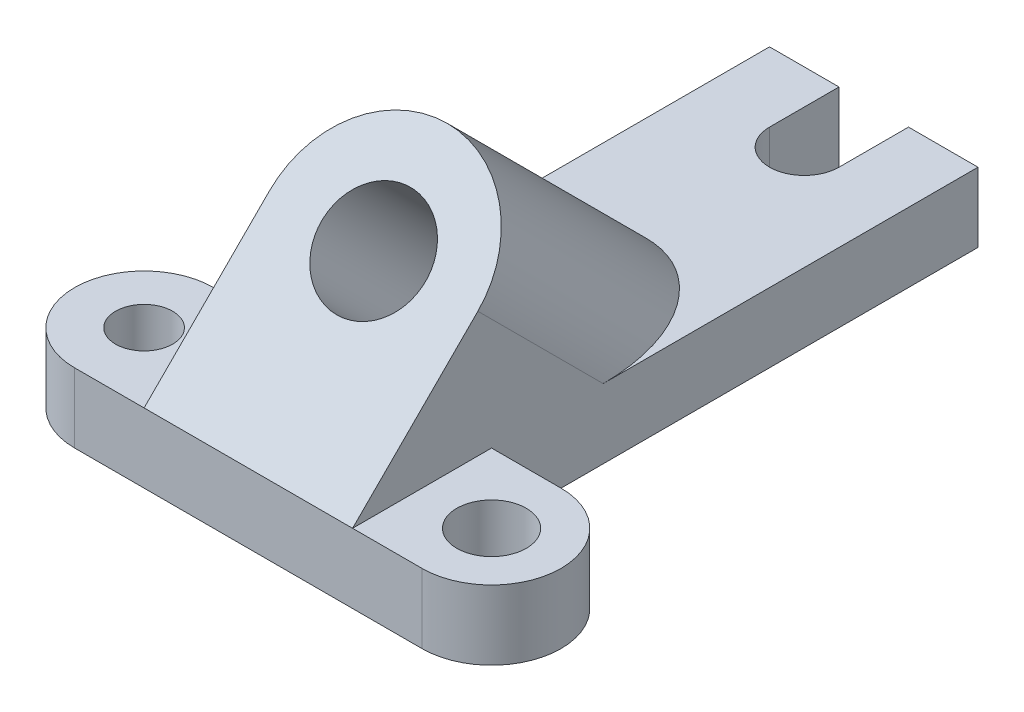
ISO-10303-21;
HEADER;
FILE_DESCRIPTION(('STEP AP214'),'2;1');
FILE_NAME('part.step','',(''),(''),'','','');
FILE_SCHEMA(('AUTOMOTIVE_DESIGN { 1 0 10303 214 1 1 1 1 }'));
ENDSEC;
DATA;
#1=APPLICATION_CONTEXT('core data for automotive mechanical design processes');
#2=APPLICATION_PROTOCOL_DEFINITION('international standard','automotive_design',2000,#1);
#3=PRODUCT_CONTEXT('',#1,'mechanical');
#4=PRODUCT('Part','Part','',(#3));
#5=PRODUCT_RELATED_PRODUCT_CATEGORY('part','',(#4));
#6=PRODUCT_DEFINITION_FORMATION('','',#4);
#7=PRODUCT_DEFINITION_CONTEXT('part definition',#1,'design');
#8=PRODUCT_DEFINITION('design','',#6,#7);
#9=PRODUCT_DEFINITION_SHAPE('','',#8);
#10=(LENGTH_UNIT() NAMED_UNIT(*) SI_UNIT(.MILLI.,.METRE.));
#11=(NAMED_UNIT(*) PLANE_ANGLE_UNIT() SI_UNIT($,.RADIAN.));
#12=(NAMED_UNIT(*) SI_UNIT($,.STERADIAN.) SOLID_ANGLE_UNIT());
#13=UNCERTAINTY_MEASURE_WITH_UNIT(LENGTH_MEASURE(1.E-05),#10,'distance_accuracy_value','');
#14=(GEOMETRIC_REPRESENTATION_CONTEXT(3) GLOBAL_UNCERTAINTY_ASSIGNED_CONTEXT((#13)) GLOBAL_UNIT_ASSIGNED_CONTEXT((#10,
#11,#12)) REPRESENTATION_CONTEXT('',''));
#15=CARTESIAN_POINT('',(0.,0.,0.));
#16=DIRECTION('',(0.,0.,1.));
#17=DIRECTION('',(1.,0.,0.));
#18=AXIS2_PLACEMENT_3D('',#15,#16,#17);
#19=CARTESIAN_POINT('',(0.,0.,0.));
#20=DIRECTION('',(0.,1.,0.));
#21=DIRECTION('',(0.,0.,1.));
#22=AXIS2_PLACEMENT_3D('',#19,#20,#21);
#23=PLANE('',#22);
#24=CARTESIAN_POINT('',(-50.,0.,63.4930824871353));
#25=DIRECTION('',(0.,1.,0.));
#26=DIRECTION('',(0.,0.,1.));
#27=AXIS2_PLACEMENT_3D('',#24,#25,#26);
#28=CIRCLE('',#27,8.21730311063648);
#29=CARTESIAN_POINT('',(-50.,0.,71.7103855977718));
#30=VERTEX_POINT('',#29);
#31=EDGE_CURVE('E237',#30,#30,#28,.T.);
#32=ORIENTED_EDGE('',*,*,#31,.F.);
#33=EDGE_LOOP('',(#32));
#34=FACE_BOUND('',#33,.T.);
#35=DIRECTION('',(0.,0.,1.));
#36=VECTOR('',#35,1.);
#37=CARTESIAN_POINT('',(-30.,0.,-58.2548729699942));
#38=LINE('',#37,#36);
#39=CARTESIAN_POINT('',(-30.,0.,43.4930824871353));
#40=VERTEX_POINT('',#39);
#41=CARTESIAN_POINT('',(-30.,0.,83.4930824871353));
#42=VERTEX_POINT('',#41);
#43=EDGE_CURVE('E77',#40,#42,#38,.T.);
#44=ORIENTED_EDGE('',*,*,#43,.F.);
#45=DIRECTION('',(1.,0.,0.));
#46=VECTOR('',#45,1.);
#47=CARTESIAN_POINT('',(0.,0.,43.4930824871353));
#48=LINE('',#47,#46);
#49=CARTESIAN_POINT('',(-50.,0.,43.4930824871353));
#50=VERTEX_POINT('',#49);
#51=EDGE_CURVE('E244',#50,#40,#48,.T.);
#52=ORIENTED_EDGE('',*,*,#51,.F.);
#53=CARTESIAN_POINT('',(-50.,0.,63.4930824871353));
#54=DIRECTION('',(0.,1.,0.));
#55=DIRECTION('',(0.,0.,1.));
#56=AXIS2_PLACEMENT_3D('',#53,#54,#55);
#57=CIRCLE('',#56,20.);
#58=CARTESIAN_POINT('',(-50.,0.,83.4930824871353));
#59=VERTEX_POINT('',#58);
#60=EDGE_CURVE('E270',#50,#59,#57,.T.);
#61=ORIENTED_EDGE('',*,*,#60,.T.);
#62=DIRECTION('',(1.,0.,0.));
#63=VECTOR('',#62,1.);
#64=CARTESIAN_POINT('',(0.,0.,83.4930824871353));
#65=LINE('',#64,#63);
#66=EDGE_CURVE('E274',#59,#42,#65,.T.);
#67=ORIENTED_EDGE('',*,*,#66,.T.);
#68=EDGE_LOOP('',(#44,#52,#61,#67));
#69=FACE_BOUND('',#68,.T.);
#70=ADVANCED_FACE('F68',(#34,#69),#23,.T.);
#71=CARTESIAN_POINT('',(50.,0.,63.4930824871353));
#72=DIRECTION('',(0.,1.,0.));
#73=DIRECTION('',(0.,0.,1.));
#74=AXIS2_PLACEMENT_3D('',#71,#72,#73);
#75=CIRCLE('',#74,10.);
#76=CARTESIAN_POINT('',(50.,0.,73.4930824871353));
#77=VERTEX_POINT('',#76);
#78=EDGE_CURVE('E227',#77,#77,#75,.T.);
#79=ORIENTED_EDGE('',*,*,#78,.F.);
#80=EDGE_LOOP('',(#79));
#81=FACE_BOUND('',#80,.T.);
#82=DIRECTION('',(1.,0.,0.));
#83=VECTOR('',#82,1.);
#84=CARTESIAN_POINT('',(0.,0.,43.4930824871353));
#85=LINE('',#84,#83);
#86=CARTESIAN_POINT('',(30.,0.,43.4930824871353));
#87=VERTEX_POINT('',#86);
#88=CARTESIAN_POINT('',(50.,0.,43.4930824871353));
#89=VERTEX_POINT('',#88);
#90=EDGE_CURVE('E280',#87,#89,#85,.T.);
#91=ORIENTED_EDGE('',*,*,#90,.F.);
#92=DIRECTION('',(0.,0.,1.));
#93=VECTOR('',#92,1.);
#94=CARTESIAN_POINT('',(30.,0.,-58.2548729699942));
#95=LINE('',#94,#93);
#96=CARTESIAN_POINT('',(30.,0.,83.4930824871353));
#97=VERTEX_POINT('',#96);
#98=EDGE_CURVE('E12',#87,#97,#95,.T.);
#99=ORIENTED_EDGE('',*,*,#98,.T.);
#100=CARTESIAN_POINT('',(50.,0.,83.4930824871353));
#101=VERTEX_POINT('',#100);
#102=EDGE_CURVE('E273',#97,#101,#65,.T.);
#103=ORIENTED_EDGE('',*,*,#102,.T.);
#104=CARTESIAN_POINT('',(50.,0.,63.4930824871353));
#105=DIRECTION('',(0.,1.,0.));
#106=DIRECTION('',(0.,0.,1.));
#107=AXIS2_PLACEMENT_3D('',#104,#105,#106);
#108=CIRCLE('',#107,20.);
#109=EDGE_CURVE('E277',#101,#89,#108,.T.);
#110=ORIENTED_EDGE('',*,*,#109,.T.);
#111=EDGE_LOOP('',(#91,#99,#103,#110));
#112=FACE_BOUND('',#111,.T.);
#113=ADVANCED_FACE('F336',(#81,#112),#23,.T.);
#114=CARTESIAN_POINT('',(0.,-20.,-96.5069175128647));
#115=DIRECTION('',(0.,0.,-1.));
#116=DIRECTION('',(-1.,0.,0.));
#117=AXIS2_PLACEMENT_3D('',#114,#115,#116);
#118=PLANE('',#117);
#119=DIRECTION('',(0.,1.,0.));
#120=VECTOR('',#119,1.);
#121=CARTESIAN_POINT('',(-10.,-20.,-96.5069175128647));
#122=LINE('',#121,#120);
#123=CARTESIAN_POINT('',(-10.,-20.,-96.5069175128647));
#124=VERTEX_POINT('',#123);
#125=CARTESIAN_POINT('',(-10.,0.,-96.5069175128647));
#126=VERTEX_POINT('',#125);
#127=EDGE_CURVE('E225',#124,#126,#122,.T.);
#128=ORIENTED_EDGE('',*,*,#127,.F.);
#129=DIRECTION('',(-1.,0.,0.));
#130=VECTOR('',#129,1.);
#131=CARTESIAN_POINT('',(0.,-20.,-96.5069175128647));
#132=LINE('',#131,#130);
#133=CARTESIAN_POINT('',(-30.,-20.,-96.5069175128647));
#134=VERTEX_POINT('',#133);
#135=EDGE_CURVE('E258',#124,#134,#132,.T.);
#136=ORIENTED_EDGE('',*,*,#135,.T.);
#137=DIRECTION('',(0.,1.,0.));
#138=VECTOR('',#137,1.);
#139=CARTESIAN_POINT('',(-30.,-20.,-96.5069175128647));
#140=LINE('',#139,#138);
#141=CARTESIAN_POINT('',(-30.,0.,-96.5069175128647));
#142=VERTEX_POINT('',#141);
#143=EDGE_CURVE('E296',#134,#142,#140,.T.);
#144=ORIENTED_EDGE('',*,*,#143,.T.);
#145=DIRECTION('',(-1.,0.,0.));
#146=VECTOR('',#145,1.);
#147=CARTESIAN_POINT('',(0.,0.,-96.5069175128647));
#148=LINE('',#147,#146);
#149=EDGE_CURVE('E285',#126,#142,#148,.T.);
#150=ORIENTED_EDGE('',*,*,#149,.F.);
#151=EDGE_LOOP('',(#128,#136,#144,#150));
#152=FACE_BOUND('',#151,.T.);
#153=ADVANCED_FACE('F355',(#152),#118,.T.);
#154=CARTESIAN_POINT('',(-50.,-20.,63.4930824871353));
#155=DIRECTION('',(0.,1.,0.));
#156=DIRECTION('',(0.,0.,1.));
#157=AXIS2_PLACEMENT_3D('',#154,#155,#156);
#158=CYLINDRICAL_SURFACE('',#157,20.);
#159=ORIENTED_EDGE('',*,*,#60,.F.);
#160=DIRECTION('',(0.,1.,0.));
#161=VECTOR('',#160,1.);
#162=CARTESIAN_POINT('',(-50.,-20.,43.4930824871353));
#163=LINE('',#162,#161);
#164=CARTESIAN_POINT('',(-50.,-20.,43.4930824871353));
#165=VERTEX_POINT('',#164);
#166=EDGE_CURVE('E206',#165,#50,#163,.T.);
#167=ORIENTED_EDGE('',*,*,#166,.F.);
#168=CARTESIAN_POINT('',(-50.,-20.,63.4930824871353));
#169=DIRECTION('',(0.,1.,0.));
#170=DIRECTION('',(0.,0.,1.));
#171=AXIS2_PLACEMENT_3D('',#168,#169,#170);
#172=CIRCLE('',#171,20.);
#173=CARTESIAN_POINT('',(-50.,-20.,83.4930824871353));
#174=VERTEX_POINT('',#173);
#175=EDGE_CURVE('E243',#165,#174,#172,.T.);
#176=ORIENTED_EDGE('',*,*,#175,.T.);
#177=DIRECTION('',(0.,1.,0.));
#178=VECTOR('',#177,1.);
#179=CARTESIAN_POINT('',(-50.,-20.,83.4930824871353));
#180=LINE('',#179,#178);
#181=EDGE_CURVE('E72',#174,#59,#180,.T.);
#182=ORIENTED_EDGE('',*,*,#181,.T.);
#183=EDGE_LOOP('',(#159,#167,#176,#182));
#184=FACE_BOUND('',#183,.T.);
#185=ADVANCED_FACE('F314',(#184),#158,.T.);
#186=CARTESIAN_POINT('',(0.,-20.,43.4930824871353));
#187=DIRECTION('',(0.,0.,1.));
#188=DIRECTION('',(1.,0.,0.));
#189=AXIS2_PLACEMENT_3D('',#186,#187,#188);
#190=PLANE('',#189);
#191=ORIENTED_EDGE('',*,*,#51,.T.);
#192=DIRECTION('',(0.,1.,0.));
#193=VECTOR('',#192,1.);
#194=CARTESIAN_POINT('',(-30.,-20.,43.4930824871353));
#195=LINE('',#194,#193);
#196=CARTESIAN_POINT('',(-30.,-20.,43.4930824871353));
#197=VERTEX_POINT('',#196);
#198=EDGE_CURVE('E294',#197,#40,#195,.T.);
#199=ORIENTED_EDGE('',*,*,#198,.F.);
#200=DIRECTION('',(1.,0.,0.));
#201=VECTOR('',#200,1.);
#202=CARTESIAN_POINT('',(0.,-20.,43.4930824871353));
#203=LINE('',#202,#201);
#204=EDGE_CURVE('E265',#165,#197,#203,.T.);
#205=ORIENTED_EDGE('',*,*,#204,.F.);
#206=ORIENTED_EDGE('',*,*,#166,.T.);
#207=EDGE_LOOP('',(#191,#199,#205,#206));
#208=FACE_BOUND('',#207,.T.);
#209=ADVANCED_FACE('F322',(#208),#190,.F.);
#210=CARTESIAN_POINT('',(-30.,-20.,0.));
#211=DIRECTION('',(1.,0.,0.));
#212=DIRECTION('',(0.,0.,-1.));
#213=AXIS2_PLACEMENT_3D('',#210,#211,#212);
#214=PLANE('',#213);
#215=ORIENTED_EDGE('',*,*,#198,.T.);
#216=ORIENTED_EDGE('',*,*,#43,.T.);
#217=DIRECTION('',(0.,0.707106781186544,-0.707106781186551));
#218=VECTOR('',#217,1.);
#219=CARTESIAN_POINT('',(-30.,41.7465412435677,41.7465412435673));
#220=LINE('',#219,#218);
#221=CARTESIAN_POINT('',(-30.,36.0624458405137,47.4306366466212));
#222=VERTEX_POINT('',#221);
#223=EDGE_CURVE('E187',#42,#222,#220,.T.);
#224=ORIENTED_EDGE('',*,*,#223,.T.);
#225=DIRECTION('',(0.,0.707106781186551,0.707106781186544));
#226=VECTOR('',#225,1.);
#227=CARTESIAN_POINT('',(-30.,-63.9389683730487,-52.5707775669402));
#228=LINE('',#227,#226);
#229=CARTESIAN_POINT('',(-30.,0.,11.3681908061078));
#230=VERTEX_POINT('',#229);
#231=EDGE_CURVE('E175',#230,#222,#228,.T.);
#232=ORIENTED_EDGE('',*,*,#231,.F.);
#233=DIRECTION('',(0.,0.,-1.));
#234=VECTOR('',#233,1.);
#235=CARTESIAN_POINT('',(-30.,0.,0.));
#236=LINE('',#235,#234);
#237=EDGE_CURVE('E289',#230,#142,#236,.T.);
#238=ORIENTED_EDGE('',*,*,#237,.T.);
#239=ORIENTED_EDGE('',*,*,#143,.F.);
#240=DIRECTION('',(0.,0.,-1.));
#241=VECTOR('',#240,1.);
#242=CARTESIAN_POINT('',(-30.,-20.,0.));
#243=LINE('',#242,#241);
#244=EDGE_CURVE('E262',#197,#134,#243,.T.);
#245=ORIENTED_EDGE('',*,*,#244,.F.);
#246=EDGE_LOOP('',(#215,#216,#224,#232,#238,#239,#245));
#247=FACE_BOUND('',#246,.T.);
#248=ADVANCED_FACE('F189',(#247),#214,.F.);
#249=DIRECTION('',(0.,1.,0.));
#250=VECTOR('',#249,1.);
#251=CARTESIAN_POINT('',(9.99999999999997,-20.,-96.5069175128647));
#252=LINE('',#251,#250);
#253=CARTESIAN_POINT('',(9.99999999999997,-20.,-96.5069175128647));
#254=VERTEX_POINT('',#253);
#255=CARTESIAN_POINT('',(9.99999999999997,0.,-96.5069175128647));
#256=VERTEX_POINT('',#255);
#257=EDGE_CURVE('E228',#254,#256,#252,.T.);
#258=ORIENTED_EDGE('',*,*,#257,.T.);
#259=CARTESIAN_POINT('',(30.,0.,-96.5069175128647));
#260=VERTEX_POINT('',#259);
#261=EDGE_CURVE('E286',#260,#256,#148,.T.);
#262=ORIENTED_EDGE('',*,*,#261,.F.);
#263=DIRECTION('',(0.,1.,0.));
#264=VECTOR('',#263,1.);
#265=CARTESIAN_POINT('',(30.,-20.,-96.5069175128647));
#266=LINE('',#265,#264);
#267=CARTESIAN_POINT('',(30.,-20.,-96.5069175128647));
#268=VERTEX_POINT('',#267);
#269=EDGE_CURVE('E299',#268,#260,#266,.T.);
#270=ORIENTED_EDGE('',*,*,#269,.F.);
#271=EDGE_CURVE('E259',#268,#254,#132,.T.);
#272=ORIENTED_EDGE('',*,*,#271,.T.);
#273=EDGE_LOOP('',(#258,#262,#270,#272));
#274=FACE_BOUND('',#273,.T.);
#275=ADVANCED_FACE('F345',(#274),#118,.T.);
#276=CARTESIAN_POINT('',(30.,-20.,0.));
#277=DIRECTION('',(1.,0.,0.));
#278=DIRECTION('',(0.,0.,-1.));
#279=AXIS2_PLACEMENT_3D('',#276,#277,#278);
#280=PLANE('',#279);
#281=DIRECTION('',(0.,0.,-1.));
#282=VECTOR('',#281,1.);
#283=CARTESIAN_POINT('',(30.,0.,0.));
#284=LINE('',#283,#282);
#285=CARTESIAN_POINT('',(30.,0.,11.3681908061078));
#286=VERTEX_POINT('',#285);
#287=EDGE_CURVE('E283',#286,#260,#284,.T.);
#288=ORIENTED_EDGE('',*,*,#287,.F.);
#289=DIRECTION('',(0.,0.707106781186551,0.707106781186544));
#290=VECTOR('',#289,1.);
#291=CARTESIAN_POINT('',(30.,-63.9389683730487,-52.5707775669402));
#292=LINE('',#291,#290);
#293=CARTESIAN_POINT('',(30.,36.0624458405137,47.4306366466212));
#294=VERTEX_POINT('',#293);
#295=EDGE_CURVE('E85',#286,#294,#292,.T.);
#296=ORIENTED_EDGE('',*,*,#295,.T.);
#297=DIRECTION('',(0.,0.707106781186544,-0.707106781186551));
#298=VECTOR('',#297,1.);
#299=CARTESIAN_POINT('',(30.,41.7465412435677,41.7465412435673));
#300=LINE('',#299,#298);
#301=EDGE_CURVE('E184',#97,#294,#300,.T.);
#302=ORIENTED_EDGE('',*,*,#301,.F.);
#303=ORIENTED_EDGE('',*,*,#98,.F.);
#304=DIRECTION('',(0.,1.,0.));
#305=VECTOR('',#304,1.);
#306=CARTESIAN_POINT('',(30.,-20.,43.4930824871353));
#307=LINE('',#306,#305);
#308=CARTESIAN_POINT('',(30.,-20.,43.4930824871353));
#309=VERTEX_POINT('',#308);
#310=EDGE_CURVE('E302',#309,#87,#307,.T.);
#311=ORIENTED_EDGE('',*,*,#310,.F.);
#312=DIRECTION('',(0.,0.,-1.));
#313=VECTOR('',#312,1.);
#314=CARTESIAN_POINT('',(30.,-20.,0.));
#315=LINE('',#314,#313);
#316=EDGE_CURVE('E255',#309,#268,#315,.T.);
#317=ORIENTED_EDGE('',*,*,#316,.T.);
#318=ORIENTED_EDGE('',*,*,#269,.T.);
#319=EDGE_LOOP('',(#288,#296,#302,#303,#311,#317,#318));
#320=FACE_BOUND('',#319,.T.);
#321=ADVANCED_FACE('F339',(#320),#280,.T.);
#322=CARTESIAN_POINT('',(0.,-20.,43.4930824871353));
#323=DIRECTION('',(0.,0.,1.));
#324=DIRECTION('',(1.,0.,0.));
#325=AXIS2_PLACEMENT_3D('',#322,#323,#324);
#326=PLANE('',#325);
#327=ORIENTED_EDGE('',*,*,#90,.T.);
#328=DIRECTION('',(0.,1.,0.));
#329=VECTOR('',#328,1.);
#330=CARTESIAN_POINT('',(50.,-20.,43.4930824871353));
#331=LINE('',#330,#329);
#332=CARTESIAN_POINT('',(50.,-20.,43.4930824871353));
#333=VERTEX_POINT('',#332);
#334=EDGE_CURVE('E305',#333,#89,#331,.T.);
#335=ORIENTED_EDGE('',*,*,#334,.F.);
#336=DIRECTION('',(1.,0.,0.));
#337=VECTOR('',#336,1.);
#338=CARTESIAN_POINT('',(0.,-20.,43.4930824871353));
#339=LINE('',#338,#337);
#340=EDGE_CURVE('E253',#309,#333,#339,.T.);
#341=ORIENTED_EDGE('',*,*,#340,.F.);
#342=ORIENTED_EDGE('',*,*,#310,.T.);
#343=EDGE_LOOP('',(#327,#335,#341,#342));
#344=FACE_BOUND('',#343,.T.);
#345=ADVANCED_FACE('F341',(#344),#326,.F.);
#346=CARTESIAN_POINT('',(50.,-20.,63.4930824871353));
#347=DIRECTION('',(0.,1.,0.));
#348=DIRECTION('',(0.,0.,1.));
#349=AXIS2_PLACEMENT_3D('',#346,#347,#348);
#350=CYLINDRICAL_SURFACE('',#349,20.);
#351=ORIENTED_EDGE('',*,*,#109,.F.);
#352=DIRECTION('',(0.,1.,0.));
#353=VECTOR('',#352,1.);
#354=CARTESIAN_POINT('',(50.,-20.,83.4930824871353));
#355=LINE('',#354,#353);
#356=CARTESIAN_POINT('',(50.,-20.,83.4930824871353));
#357=VERTEX_POINT('',#356);
#358=EDGE_CURVE('E306',#357,#101,#355,.T.);
#359=ORIENTED_EDGE('',*,*,#358,.F.);
#360=CARTESIAN_POINT('',(50.,-20.,63.4930824871353));
#361=DIRECTION('',(0.,1.,0.));
#362=DIRECTION('',(0.,0.,1.));
#363=AXIS2_PLACEMENT_3D('',#360,#361,#362);
#364=CIRCLE('',#363,20.);
#365=EDGE_CURVE('E250',#357,#333,#364,.T.);
#366=ORIENTED_EDGE('',*,*,#365,.T.);
#367=ORIENTED_EDGE('',*,*,#334,.T.);
#368=EDGE_LOOP('',(#351,#359,#366,#367));
#369=FACE_BOUND('',#368,.T.);
#370=ADVANCED_FACE('F333',(#369),#350,.T.);
#371=CARTESIAN_POINT('',(-50.,-20.,63.4930824871353));
#372=DIRECTION('',(0.,1.,0.));
#373=DIRECTION('',(0.,0.,1.));
#374=AXIS2_PLACEMENT_3D('',#371,#372,#373);
#375=CYLINDRICAL_SURFACE('',#374,8.21730311063648);
#376=CARTESIAN_POINT('',(-50.,-20.,63.4930824871353));
#377=DIRECTION('',(0.,1.,0.));
#378=DIRECTION('',(0.,0.,1.));
#379=AXIS2_PLACEMENT_3D('',#376,#377,#378);
#380=CIRCLE('',#379,8.21730311063648);
#381=CARTESIAN_POINT('',(-50.,-20.,71.7103855977718));
#382=VERTEX_POINT('',#381);
#383=EDGE_CURVE('E240',#382,#382,#380,.T.);
#384=ORIENTED_EDGE('',*,*,#383,.F.);
#385=EDGE_LOOP('',(#384));
#386=FACE_BOUND('',#385,.T.);
#387=ORIENTED_EDGE('',*,*,#31,.T.);
#388=EDGE_LOOP('',(#387));
#389=FACE_BOUND('',#388,.T.);
#390=ADVANCED_FACE('F70',(#386,#389),#375,.F.);
#391=CARTESIAN_POINT('',(0.,-20.,83.4930824871353));
#392=DIRECTION('',(0.,0.,1.));
#393=DIRECTION('',(1.,0.,0.));
#394=AXIS2_PLACEMENT_3D('',#391,#392,#393);
#395=PLANE('',#394);
#396=ORIENTED_EDGE('',*,*,#66,.F.);
#397=ORIENTED_EDGE('',*,*,#181,.F.);
#398=DIRECTION('',(1.,0.,0.));
#399=VECTOR('',#398,1.);
#400=CARTESIAN_POINT('',(0.,-20.,83.4930824871353));
#401=LINE('',#400,#399);
#402=EDGE_CURVE('E247',#174,#357,#401,.T.);
#403=ORIENTED_EDGE('',*,*,#402,.T.);
#404=ORIENTED_EDGE('',*,*,#358,.T.);
#405=ORIENTED_EDGE('',*,*,#102,.F.);
#406=DIRECTION('',(1.,0.,0.));
#407=VECTOR('',#406,1.);
#408=CARTESIAN_POINT('',(0.,0.,83.4930824871353));
#409=LINE('',#408,#407);
#410=EDGE_CURVE('E192',#42,#97,#409,.T.);
#411=ORIENTED_EDGE('',*,*,#410,.F.);
#412=EDGE_LOOP('',(#396,#397,#403,#404,#405,#411));
#413=FACE_BOUND('',#412,.T.);
#414=ADVANCED_FACE('F317',(#413),#395,.T.);
#415=CARTESIAN_POINT('',(0.,-20.,0.));
#416=DIRECTION('',(0.,1.,0.));
#417=DIRECTION('',(0.,0.,1.));
#418=AXIS2_PLACEMENT_3D('',#415,#416,#417);
#419=PLANE('',#418);
#420=ORIENTED_EDGE('',*,*,#135,.F.);
#421=DIRECTION('',(0.,0.,1.));
#422=VECTOR('',#421,1.);
#423=CARTESIAN_POINT('',(-10.,-20.,-96.5069175128647));
#424=LINE('',#423,#422);
#425=CARTESIAN_POINT('',(-10.,-20.,-76.5069175128647));
#426=VERTEX_POINT('',#425);
#427=EDGE_CURVE('E209',#124,#426,#424,.T.);
#428=ORIENTED_EDGE('',*,*,#427,.T.);
#429=CARTESIAN_POINT('',(0.,-20.,-76.5069175128647));
#430=DIRECTION('',(0.,1.,0.));
#431=DIRECTION('',(0.,0.,1.));
#432=AXIS2_PLACEMENT_3D('',#429,#430,#431);
#433=CIRCLE('',#432,10.);
#434=CARTESIAN_POINT('',(9.99999999999998,-20.,-76.5069175128647));
#435=VERTEX_POINT('',#434);
#436=EDGE_CURVE('E212',#426,#435,#433,.T.);
#437=ORIENTED_EDGE('',*,*,#436,.T.);
#438=DIRECTION('',(0.,0.,-1.));
#439=VECTOR('',#438,1.);
#440=CARTESIAN_POINT('',(9.99999999999997,-20.,-96.5069175128647));
#441=LINE('',#440,#439);
#442=EDGE_CURVE('E216',#435,#254,#441,.T.);
#443=ORIENTED_EDGE('',*,*,#442,.T.);
#444=ORIENTED_EDGE('',*,*,#271,.F.);
#445=ORIENTED_EDGE('',*,*,#316,.F.);
#446=ORIENTED_EDGE('',*,*,#340,.T.);
#447=ORIENTED_EDGE('',*,*,#365,.F.);
#448=ORIENTED_EDGE('',*,*,#402,.F.);
#449=ORIENTED_EDGE('',*,*,#175,.F.);
#450=ORIENTED_EDGE('',*,*,#204,.T.);
#451=ORIENTED_EDGE('',*,*,#244,.T.);
#452=EDGE_LOOP('',(#420,#428,#437,#443,#444,#445,#446,#447,#448,#449,#450,#451));
#453=FACE_BOUND('',#452,.T.);
#454=CARTESIAN_POINT('',(50.,-20.,63.4930824871353));
#455=DIRECTION('',(0.,1.,0.));
#456=DIRECTION('',(0.,0.,1.));
#457=AXIS2_PLACEMENT_3D('',#454,#455,#456);
#458=CIRCLE('',#457,10.);
#459=CARTESIAN_POINT('',(50.,-20.,73.4930824871353));
#460=VERTEX_POINT('',#459);
#461=EDGE_CURVE('E234',#460,#460,#458,.T.);
#462=ORIENTED_EDGE('',*,*,#461,.T.);
#463=EDGE_LOOP('',(#462));
#464=FACE_BOUND('',#463,.T.);
#465=ORIENTED_EDGE('',*,*,#383,.T.);
#466=EDGE_LOOP('',(#465));
#467=FACE_BOUND('',#466,.T.);
#468=ADVANCED_FACE('F326',(#453,#464,#467),#419,.F.);
#469=ORIENTED_EDGE('',*,*,#237,.F.);
#470=CARTESIAN_POINT('',(0.,0.,11.3681908061079));
#471=DIRECTION('',(0.,1.,0.));
#472=DIRECTION('',(0.,0.,1.));
#473=AXIS2_PLACEMENT_3D('',#470,#471,#472);
#474=ELLIPSE('',#473,42.4264068711927,30.);
#475=EDGE_CURVE('E181',#230,#286,#474,.F.);
#476=ORIENTED_EDGE('',*,*,#475,.T.);
#477=ORIENTED_EDGE('',*,*,#287,.T.);
#478=ORIENTED_EDGE('',*,*,#261,.T.);
#479=DIRECTION('',(0.,0.,-1.));
#480=VECTOR('',#479,1.);
#481=CARTESIAN_POINT('',(9.99999999999997,0.,-96.5069175128647));
#482=LINE('',#481,#480);
#483=CARTESIAN_POINT('',(9.99999999999998,0.,-76.5069175128647));
#484=VERTEX_POINT('',#483);
#485=EDGE_CURVE('E213',#484,#256,#482,.T.);
#486=ORIENTED_EDGE('',*,*,#485,.F.);
#487=CARTESIAN_POINT('',(0.,0.,-76.5069175128647));
#488=DIRECTION('',(0.,1.,0.));
#489=DIRECTION('',(0.,0.,1.));
#490=AXIS2_PLACEMENT_3D('',#487,#488,#489);
#491=CIRCLE('',#490,10.);
#492=CARTESIAN_POINT('',(-10.,0.,-76.5069175128647));
#493=VERTEX_POINT('',#492);
#494=EDGE_CURVE('E221',#493,#484,#491,.T.);
#495=ORIENTED_EDGE('',*,*,#494,.F.);
#496=DIRECTION('',(0.,0.,1.));
#497=VECTOR('',#496,1.);
#498=CARTESIAN_POINT('',(-10.,0.,-96.5069175128647));
#499=LINE('',#498,#497);
#500=EDGE_CURVE('E93',#126,#493,#499,.T.);
#501=ORIENTED_EDGE('',*,*,#500,.F.);
#502=ORIENTED_EDGE('',*,*,#149,.T.);
#503=EDGE_LOOP('',(#469,#476,#477,#478,#486,#495,#501,#502));
#504=FACE_BOUND('',#503,.T.);
#505=ADVANCED_FACE('F348',(#504),#23,.T.);
#506=CARTESIAN_POINT('',(50.,-20.,63.4930824871353));
#507=DIRECTION('',(0.,1.,0.));
#508=DIRECTION('',(0.,0.,1.));
#509=AXIS2_PLACEMENT_3D('',#506,#507,#508);
#510=CYLINDRICAL_SURFACE('',#509,10.);
#511=ORIENTED_EDGE('',*,*,#461,.F.);
#512=EDGE_LOOP('',(#511));
#513=FACE_BOUND('',#512,.T.);
#514=ORIENTED_EDGE('',*,*,#78,.T.);
#515=EDGE_LOOP('',(#514));
#516=FACE_BOUND('',#515,.T.);
#517=ADVANCED_FACE('F370',(#513,#516),#510,.F.);
#518=CARTESIAN_POINT('',(-10.,-20.,-96.5069175128647));
#519=DIRECTION('',(-1.,0.,0.));
#520=DIRECTION('',(0.,0.,1.));
#521=AXIS2_PLACEMENT_3D('',#518,#519,#520);
#522=PLANE('',#521);
#523=ORIENTED_EDGE('',*,*,#500,.T.);
#524=DIRECTION('',(0.,1.,0.));
#525=VECTOR('',#524,1.);
#526=CARTESIAN_POINT('',(-10.,-20.,-76.5069175128647));
#527=LINE('',#526,#525);
#528=EDGE_CURVE('E219',#426,#493,#527,.T.);
#529=ORIENTED_EDGE('',*,*,#528,.F.);
#530=ORIENTED_EDGE('',*,*,#427,.F.);
#531=ORIENTED_EDGE('',*,*,#127,.T.);
#532=EDGE_LOOP('',(#523,#529,#530,#531));
#533=FACE_BOUND('',#532,.T.);
#534=ADVANCED_FACE('F357',(#533),#522,.F.);
#535=CARTESIAN_POINT('',(9.99999999999997,-20.,-96.5069175128647));
#536=DIRECTION('',(1.,0.,0.));
#537=DIRECTION('',(0.,0.,-1.));
#538=AXIS2_PLACEMENT_3D('',#535,#536,#537);
#539=PLANE('',#538);
#540=ORIENTED_EDGE('',*,*,#485,.T.);
#541=ORIENTED_EDGE('',*,*,#257,.F.);
#542=ORIENTED_EDGE('',*,*,#442,.F.);
#543=DIRECTION('',(0.,1.,0.));
#544=VECTOR('',#543,1.);
#545=CARTESIAN_POINT('',(9.99999999999998,-20.,-76.5069175128647));
#546=LINE('',#545,#544);
#547=EDGE_CURVE('E231',#435,#484,#546,.T.);
#548=ORIENTED_EDGE('',*,*,#547,.T.);
#549=EDGE_LOOP('',(#540,#541,#542,#548));
#550=FACE_BOUND('',#549,.T.);
#551=ADVANCED_FACE('F362',(#550),#539,.F.);
#552=CARTESIAN_POINT('',(0.,-20.,-76.5069175128647));
#553=DIRECTION('',(0.,1.,0.));
#554=DIRECTION('',(0.,0.,1.));
#555=AXIS2_PLACEMENT_3D('',#552,#553,#554);
#556=CYLINDRICAL_SURFACE('',#555,10.);
#557=ORIENTED_EDGE('',*,*,#494,.T.);
#558=ORIENTED_EDGE('',*,*,#547,.F.);
#559=ORIENTED_EDGE('',*,*,#436,.F.);
#560=ORIENTED_EDGE('',*,*,#528,.T.);
#561=EDGE_LOOP('',(#557,#558,#559,#560));
#562=FACE_BOUND('',#561,.T.);
#563=ADVANCED_FACE('F359',(#562),#556,.F.);
#564=CARTESIAN_POINT('',(0.,-63.9389683730487,-52.5707775669402));
#565=DIRECTION('',(0.,0.707106781186551,0.707106781186544));
#566=DIRECTION('',(0.,-0.707106781186544,0.707106781186551));
#567=AXIS2_PLACEMENT_3D('',#564,#565,#566);
#568=CYLINDRICAL_SURFACE('',#567,30.);
#569=ORIENTED_EDGE('',*,*,#475,.F.);
#570=ORIENTED_EDGE('',*,*,#231,.T.);
#571=CARTESIAN_POINT('',(0.,36.0624458405138,47.4306366466212));
#572=DIRECTION('',(0.,0.707106781186551,0.707106781186544));
#573=DIRECTION('',(0.,-0.707106781186544,0.707106781186551));
#574=AXIS2_PLACEMENT_3D('',#571,#572,#573);
#575=CIRCLE('',#574,30.);
#576=EDGE_CURVE('E179',#294,#222,#575,.T.);
#577=ORIENTED_EDGE('',*,*,#576,.F.);
#578=ORIENTED_EDGE('',*,*,#295,.F.);
#579=EDGE_LOOP('',(#569,#570,#577,#578));
#580=FACE_BOUND('',#579,.T.);
#581=ADVANCED_FACE('F177',(#580),#568,.T.);
#582=CARTESIAN_POINT('',(0.,-63.9389683730487,-52.5707775669402));
#583=DIRECTION('',(0.,0.707106781186551,0.707106781186544));
#584=DIRECTION('',(0.,-0.707106781186544,0.707106781186551));
#585=AXIS2_PLACEMENT_3D('',#582,#583,#584);
#586=CYLINDRICAL_SURFACE('',#585,15.);
#587=CARTESIAN_POINT('',(0.,0.,11.3681908061079));
#588=DIRECTION('',(0.,1.,0.));
#589=DIRECTION('',(0.,0.,1.));
#590=AXIS2_PLACEMENT_3D('',#587,#588,#589);
#591=ELLIPSE('',#590,21.2132034355963,15.);
#592=CARTESIAN_POINT('',(0.,0.,32.5813942417042));
#593=VERTEX_POINT('',#592);
#594=EDGE_CURVE('E203',#593,#593,#591,.F.);
#595=ORIENTED_EDGE('',*,*,#594,.T.);
#596=EDGE_LOOP('',(#595));
#597=FACE_BOUND('',#596,.T.);
#598=CARTESIAN_POINT('',(0.,36.0624458405138,47.4306366466212));
#599=DIRECTION('',(0.,0.707106781186551,0.707106781186544));
#600=DIRECTION('',(0.,-0.707106781186544,0.707106781186551));
#601=AXIS2_PLACEMENT_3D('',#598,#599,#600);
#602=CIRCLE('',#601,15.);
#603=CARTESIAN_POINT('',(0.,25.4558441227156,58.0372383644195));
#604=VERTEX_POINT('',#603);
#605=EDGE_CURVE('E193',#604,#604,#602,.T.);
#606=ORIENTED_EDGE('',*,*,#605,.T.);
#607=EDGE_LOOP('',(#606));
#608=FACE_BOUND('',#607,.T.);
#609=ADVANCED_FACE('F398',(#597,#608),#586,.F.);
#610=CARTESIAN_POINT('',(0.,41.7465412435677,41.7465412435673));
#611=DIRECTION('',(0.,0.707106781186551,0.707106781186544));
#612=DIRECTION('',(0.,-0.707106781186544,0.707106781186551));
#613=AXIS2_PLACEMENT_3D('',#610,#611,#612);
#614=PLANE('',#613);
#615=ORIENTED_EDGE('',*,*,#605,.F.);
#616=EDGE_LOOP('',(#615));
#617=FACE_BOUND('',#616,.T.);
#618=ORIENTED_EDGE('',*,*,#301,.T.);
#619=ORIENTED_EDGE('',*,*,#576,.T.);
#620=ORIENTED_EDGE('',*,*,#223,.F.);
#621=ORIENTED_EDGE('',*,*,#410,.T.);
#622=EDGE_LOOP('',(#618,#619,#620,#621));
#623=FACE_BOUND('',#622,.T.);
#624=ADVANCED_FACE('F195',(#617,#623),#614,.T.);
#625=ORIENTED_EDGE('',*,*,#594,.F.);
#626=EDGE_LOOP('',(#625));
#627=FACE_BOUND('',#626,.T.);
#628=ADVANCED_FACE('F380',(#627),#23,.T.);
#629=CLOSED_SHELL('',(#70,#113,#153,#185,#209,#248,#275,#321,#345,#370,#390,#414,#468,#505,#517,
#534,#551,#563,#581,#609,#624,#628));
#630=MANIFOLD_SOLID_BREP('B2',#629);
#631=ADVANCED_BREP_SHAPE_REPRESENTATION('',(#18,#630),#14);
#632=SHAPE_DEFINITION_REPRESENTATION(#9,#631);
ENDSEC;
END-ISO-10303-21;
